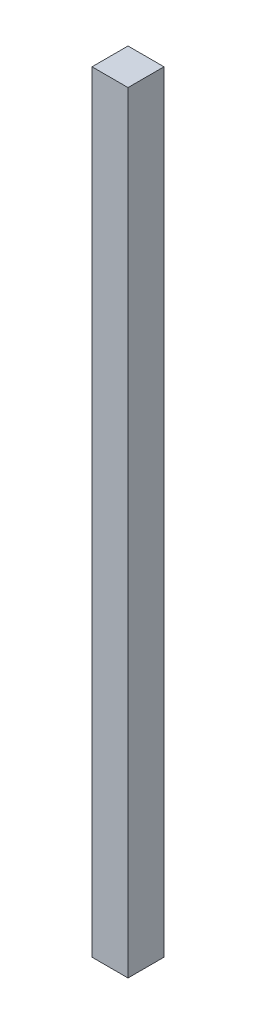
ISO-10303-21;
HEADER;
FILE_DESCRIPTION(('STEP AP214'),'2;1');
FILE_NAME('part.step','',(''),(''),'','','');
FILE_SCHEMA(('AUTOMOTIVE_DESIGN { 1 0 10303 214 1 1 1 1 }'));
ENDSEC;
DATA;
#1=APPLICATION_CONTEXT('core data for automotive mechanical design processes');
#2=APPLICATION_PROTOCOL_DEFINITION('international standard','automotive_design',2000,#1);
#3=PRODUCT_CONTEXT('',#1,'mechanical');
#4=PRODUCT('Part','Part','',(#3));
#5=PRODUCT_RELATED_PRODUCT_CATEGORY('part','',(#4));
#6=PRODUCT_DEFINITION_FORMATION('','',#4);
#7=PRODUCT_DEFINITION_CONTEXT('part definition',#1,'design');
#8=PRODUCT_DEFINITION('design','',#6,#7);
#9=PRODUCT_DEFINITION_SHAPE('','',#8);
#10=(LENGTH_UNIT() NAMED_UNIT(*) SI_UNIT(.MILLI.,.METRE.));
#11=(NAMED_UNIT(*) PLANE_ANGLE_UNIT() SI_UNIT($,.RADIAN.));
#12=(NAMED_UNIT(*) SI_UNIT($,.STERADIAN.) SOLID_ANGLE_UNIT());
#13=UNCERTAINTY_MEASURE_WITH_UNIT(LENGTH_MEASURE(1.E-05),#10,'distance_accuracy_value','');
#14=(GEOMETRIC_REPRESENTATION_CONTEXT(3) GLOBAL_UNCERTAINTY_ASSIGNED_CONTEXT((#13)) GLOBAL_UNIT_ASSIGNED_CONTEXT((#10,
#11,#12)) REPRESENTATION_CONTEXT('',''));
#15=CARTESIAN_POINT('',(0.,0.,0.));
#16=DIRECTION('',(0.,0.,1.));
#17=DIRECTION('',(1.,0.,0.));
#18=AXIS2_PLACEMENT_3D('',#15,#16,#17);
#19=CARTESIAN_POINT('',(-24.5945945945946,1500.,-16.2162162162162));
#20=DIRECTION('',(1.,0.,0.));
#21=DIRECTION('',(0.,0.,-1.));
#22=AXIS2_PLACEMENT_3D('',#19,#20,#21);
#23=PLANE('',#22);
#24=DIRECTION('',(0.,0.,1.));
#25=VECTOR('',#24,1.);
#26=CARTESIAN_POINT('',(-24.5945945945946,0.,-16.2162162162162));
#27=LINE('',#26,#25);
#28=CARTESIAN_POINT('',(-24.5945945945946,0.,-16.2162162162162));
#29=VERTEX_POINT('',#28);
#30=CARTESIAN_POINT('',(-24.5945945945946,0.,53.7837837837838));
#31=VERTEX_POINT('',#30);
#32=EDGE_CURVE('E102',#29,#31,#27,.T.);
#33=ORIENTED_EDGE('',*,*,#32,.T.);
#34=DIRECTION('',(0.,-1.,0.));
#35=VECTOR('',#34,1.);
#36=CARTESIAN_POINT('',(-24.5945945945946,1500.,53.7837837837838));
#37=LINE('',#36,#35);
#38=CARTESIAN_POINT('',(-24.5945945945946,1500.,53.7837837837838));
#39=VERTEX_POINT('',#38);
#40=EDGE_CURVE('E11',#39,#31,#37,.T.);
#41=ORIENTED_EDGE('',*,*,#40,.F.);
#42=DIRECTION('',(0.,0.,1.));
#43=VECTOR('',#42,1.);
#44=CARTESIAN_POINT('',(-24.5945945945946,1500.,-16.2162162162162));
#45=LINE('',#44,#43);
#46=CARTESIAN_POINT('',(-24.5945945945946,1500.,-16.2162162162162));
#47=VERTEX_POINT('',#46);
#48=EDGE_CURVE('E90',#47,#39,#45,.T.);
#49=ORIENTED_EDGE('',*,*,#48,.F.);
#50=DIRECTION('',(0.,-1.,0.));
#51=VECTOR('',#50,1.);
#52=CARTESIAN_POINT('',(-24.5945945945946,1500.,-16.2162162162162));
#53=LINE('',#52,#51);
#54=EDGE_CURVE('E98',#47,#29,#53,.T.);
#55=ORIENTED_EDGE('',*,*,#54,.T.);
#56=EDGE_LOOP('',(#33,#41,#49,#55));
#57=FACE_BOUND('',#56,.T.);
#58=ADVANCED_FACE('F39',(#57),#23,.F.);
#59=CARTESIAN_POINT('',(-24.5945945945946,1500.,53.7837837837838));
#60=DIRECTION('',(0.,0.,-1.));
#61=DIRECTION('',(-1.,0.,0.));
#62=AXIS2_PLACEMENT_3D('',#59,#60,#61);
#63=PLANE('',#62);
#64=DIRECTION('',(1.,0.,0.));
#65=VECTOR('',#64,1.);
#66=CARTESIAN_POINT('',(-24.5945945945946,0.,53.7837837837838));
#67=LINE('',#66,#65);
#68=CARTESIAN_POINT('',(45.4054054054054,0.,53.7837837837838));
#69=VERTEX_POINT('',#68);
#70=EDGE_CURVE('E94',#31,#69,#67,.T.);
#71=ORIENTED_EDGE('',*,*,#70,.T.);
#72=DIRECTION('',(0.,-1.,0.));
#73=VECTOR('',#72,1.);
#74=CARTESIAN_POINT('',(45.4054054054054,1500.,53.7837837837838));
#75=LINE('',#74,#73);
#76=CARTESIAN_POINT('',(45.4054054054054,1500.,53.7837837837838));
#77=VERTEX_POINT('',#76);
#78=EDGE_CURVE('E47',#77,#69,#75,.T.);
#79=ORIENTED_EDGE('',*,*,#78,.F.);
#80=DIRECTION('',(1.,0.,0.));
#81=VECTOR('',#80,1.);
#82=CARTESIAN_POINT('',(-24.5945945945946,1500.,53.7837837837838));
#83=LINE('',#82,#81);
#84=EDGE_CURVE('E85',#39,#77,#83,.T.);
#85=ORIENTED_EDGE('',*,*,#84,.F.);
#86=ORIENTED_EDGE('',*,*,#40,.T.);
#87=EDGE_LOOP('',(#71,#79,#85,#86));
#88=FACE_BOUND('',#87,.T.);
#89=ADVANCED_FACE('F93',(#88),#63,.F.);
#90=CARTESIAN_POINT('',(45.4054054054054,1500.,-16.2162162162162));
#91=DIRECTION('',(-1.,0.,0.));
#92=DIRECTION('',(0.,0.,1.));
#93=AXIS2_PLACEMENT_3D('',#90,#91,#92);
#94=PLANE('',#93);
#95=DIRECTION('',(0.,0.,-1.));
#96=VECTOR('',#95,1.);
#97=CARTESIAN_POINT('',(45.4054054054054,0.,-16.2162162162162));
#98=LINE('',#97,#96);
#99=CARTESIAN_POINT('',(45.4054054054054,0.,-16.2162162162162));
#100=VERTEX_POINT('',#99);
#101=EDGE_CURVE('E72',#69,#100,#98,.T.);
#102=ORIENTED_EDGE('',*,*,#101,.T.);
#103=DIRECTION('',(0.,-1.,0.));
#104=VECTOR('',#103,1.);
#105=CARTESIAN_POINT('',(45.4054054054054,1500.,-16.2162162162162));
#106=LINE('',#105,#104);
#107=CARTESIAN_POINT('',(45.4054054054054,1500.,-16.2162162162162));
#108=VERTEX_POINT('',#107);
#109=EDGE_CURVE('E95',#108,#100,#106,.T.);
#110=ORIENTED_EDGE('',*,*,#109,.F.);
#111=DIRECTION('',(0.,0.,-1.));
#112=VECTOR('',#111,1.);
#113=CARTESIAN_POINT('',(45.4054054054054,1500.,-16.2162162162162));
#114=LINE('',#113,#112);
#115=EDGE_CURVE('E88',#77,#108,#114,.T.);
#116=ORIENTED_EDGE('',*,*,#115,.F.);
#117=ORIENTED_EDGE('',*,*,#78,.T.);
#118=EDGE_LOOP('',(#102,#110,#116,#117));
#119=FACE_BOUND('',#118,.T.);
#120=ADVANCED_FACE('F96',(#119),#94,.F.);
#121=CARTESIAN_POINT('',(-24.5945945945946,1500.,-16.2162162162162));
#122=DIRECTION('',(0.,0.,1.));
#123=DIRECTION('',(1.,0.,0.));
#124=AXIS2_PLACEMENT_3D('',#121,#122,#123);
#125=PLANE('',#124);
#126=DIRECTION('',(-1.,0.,0.));
#127=VECTOR('',#126,1.);
#128=CARTESIAN_POINT('',(-24.5945945945946,0.,-16.2162162162162));
#129=LINE('',#128,#127);
#130=EDGE_CURVE('E78',#100,#29,#129,.T.);
#131=ORIENTED_EDGE('',*,*,#130,.T.);
#132=ORIENTED_EDGE('',*,*,#54,.F.);
#133=DIRECTION('',(-1.,0.,0.));
#134=VECTOR('',#133,1.);
#135=CARTESIAN_POINT('',(-24.5945945945946,1500.,-16.2162162162162));
#136=LINE('',#135,#134);
#137=EDGE_CURVE('E55',#108,#47,#136,.T.);
#138=ORIENTED_EDGE('',*,*,#137,.F.);
#139=ORIENTED_EDGE('',*,*,#109,.T.);
#140=EDGE_LOOP('',(#131,#132,#138,#139));
#141=FACE_BOUND('',#140,.T.);
#142=ADVANCED_FACE('F109',(#141),#125,.F.);
#143=CARTESIAN_POINT('',(0.,1500.,0.));
#144=DIRECTION('',(0.,1.,0.));
#145=DIRECTION('',(0.,0.,1.));
#146=AXIS2_PLACEMENT_3D('',#143,#144,#145);
#147=PLANE('',#146);
#148=ORIENTED_EDGE('',*,*,#48,.T.);
#149=ORIENTED_EDGE('',*,*,#84,.T.);
#150=ORIENTED_EDGE('',*,*,#115,.T.);
#151=ORIENTED_EDGE('',*,*,#137,.T.);
#152=EDGE_LOOP('',(#148,#149,#150,#151));
#153=FACE_BOUND('',#152,.T.);
#154=ADVANCED_FACE('F86',(#153),#147,.T.);
#155=CARTESIAN_POINT('',(0.,0.,0.));
#156=DIRECTION('',(0.,1.,0.));
#157=DIRECTION('',(0.,0.,1.));
#158=AXIS2_PLACEMENT_3D('',#155,#156,#157);
#159=PLANE('',#158);
#160=ORIENTED_EDGE('',*,*,#32,.F.);
#161=ORIENTED_EDGE('',*,*,#130,.F.);
#162=ORIENTED_EDGE('',*,*,#101,.F.);
#163=ORIENTED_EDGE('',*,*,#70,.F.);
#164=EDGE_LOOP('',(#160,#161,#162,#163));
#165=FACE_BOUND('',#164,.T.);
#166=ADVANCED_FACE('F112',(#165),#159,.F.);
#167=CLOSED_SHELL('',(#58,#89,#120,#142,#154,#166));
#168=MANIFOLD_SOLID_BREP('B2',#167);
#169=ADVANCED_BREP_SHAPE_REPRESENTATION('',(#18,#168),#14);
#170=SHAPE_DEFINITION_REPRESENTATION(#9,#169);
ENDSEC;
END-ISO-10303-21;
